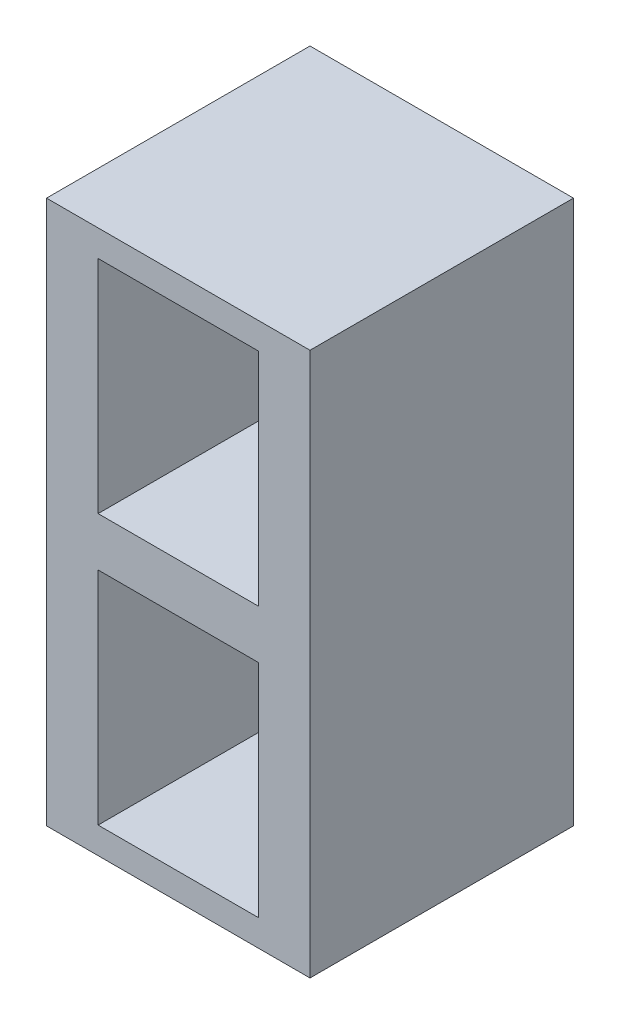
ISO-10303-21;
HEADER;
FILE_DESCRIPTION(('STEP AP214'),'2;1');
FILE_NAME('part.step','',(''),(''),'','','');
FILE_SCHEMA(('AUTOMOTIVE_DESIGN { 1 0 10303 214 1 1 1 1 }'));
ENDSEC;
DATA;
#1=APPLICATION_CONTEXT('core data for automotive mechanical design processes');
#2=APPLICATION_PROTOCOL_DEFINITION('international standard','automotive_design',2000,#1);
#3=PRODUCT_CONTEXT('',#1,'mechanical');
#4=PRODUCT('Part','Part','',(#3));
#5=PRODUCT_RELATED_PRODUCT_CATEGORY('part','',(#4));
#6=PRODUCT_DEFINITION_FORMATION('','',#4);
#7=PRODUCT_DEFINITION_CONTEXT('part definition',#1,'design');
#8=PRODUCT_DEFINITION('design','',#6,#7);
#9=PRODUCT_DEFINITION_SHAPE('','',#8);
#10=(LENGTH_UNIT() NAMED_UNIT(*) SI_UNIT(.MILLI.,.METRE.));
#11=(NAMED_UNIT(*) PLANE_ANGLE_UNIT() SI_UNIT($,.RADIAN.));
#12=(NAMED_UNIT(*) SI_UNIT($,.STERADIAN.) SOLID_ANGLE_UNIT());
#13=UNCERTAINTY_MEASURE_WITH_UNIT(LENGTH_MEASURE(1.E-05),#10,'distance_accuracy_value','');
#14=(GEOMETRIC_REPRESENTATION_CONTEXT(3) GLOBAL_UNCERTAINTY_ASSIGNED_CONTEXT((#13)) GLOBAL_UNIT_ASSIGNED_CONTEXT((#10,
#11,#12)) REPRESENTATION_CONTEXT('',''));
#15=CARTESIAN_POINT('',(0.,0.,0.));
#16=DIRECTION('',(0.,0.,1.));
#17=DIRECTION('',(1.,0.,0.));
#18=AXIS2_PLACEMENT_3D('',#15,#16,#17);
#19=CARTESIAN_POINT('',(94.5,390.,-94.5));
#20=DIRECTION('',(-1.,0.,0.));
#21=DIRECTION('',(0.,0.,1.));
#22=AXIS2_PLACEMENT_3D('',#19,#20,#21);
#23=PLANE('',#22);
#24=DIRECTION('',(0.,0.,-1.));
#25=VECTOR('',#24,1.);
#26=CARTESIAN_POINT('',(94.5,0.,-94.5));
#27=LINE('',#26,#25);
#28=CARTESIAN_POINT('',(94.5,0.,94.5));
#29=VERTEX_POINT('',#28);
#30=CARTESIAN_POINT('',(94.5,0.,-94.5));
#31=VERTEX_POINT('',#30);
#32=EDGE_CURVE('E183',#29,#31,#27,.T.);
#33=ORIENTED_EDGE('',*,*,#32,.T.);
#34=DIRECTION('',(0.,-1.,0.));
#35=VECTOR('',#34,1.);
#36=CARTESIAN_POINT('',(94.5,390.,-94.5));
#37=LINE('',#36,#35);
#38=CARTESIAN_POINT('',(94.5,390.,-94.5));
#39=VERTEX_POINT('',#38);
#40=EDGE_CURVE('E11',#39,#31,#37,.T.);
#41=ORIENTED_EDGE('',*,*,#40,.F.);
#42=DIRECTION('',(0.,0.,-1.));
#43=VECTOR('',#42,1.);
#44=CARTESIAN_POINT('',(94.5,390.,-94.5));
#45=LINE('',#44,#43);
#46=CARTESIAN_POINT('',(94.5,390.,94.5));
#47=VERTEX_POINT('',#46);
#48=EDGE_CURVE('E190',#47,#39,#45,.T.);
#49=ORIENTED_EDGE('',*,*,#48,.F.);
#50=DIRECTION('',(0.,-1.,0.));
#51=VECTOR('',#50,1.);
#52=CARTESIAN_POINT('',(94.5,390.,94.5));
#53=LINE('',#52,#51);
#54=EDGE_CURVE('E200',#47,#29,#53,.T.);
#55=ORIENTED_EDGE('',*,*,#54,.T.);
#56=EDGE_LOOP('',(#33,#41,#49,#55));
#57=FACE_BOUND('',#56,.T.);
#58=ADVANCED_FACE('F33',(#57),#23,.F.);
#59=CARTESIAN_POINT('',(94.5,390.,-94.5));
#60=DIRECTION('',(0.,0.,1.));
#61=DIRECTION('',(1.,0.,0.));
#62=AXIS2_PLACEMENT_3D('',#59,#60,#61);
#63=PLANE('',#62);
#64=DIRECTION('',(0.,-1.,0.));
#65=VECTOR('',#64,1.);
#66=CARTESIAN_POINT('',(-57.5,19.,-94.5));
#67=LINE('',#66,#65);
#68=CARTESIAN_POINT('',(-57.5,177.5,-94.5));
#69=VERTEX_POINT('',#68);
#70=CARTESIAN_POINT('',(-57.5,19.,-94.5));
#71=VERTEX_POINT('',#70);
#72=EDGE_CURVE('E129',#69,#71,#67,.T.);
#73=ORIENTED_EDGE('',*,*,#72,.T.);
#74=DIRECTION('',(1.,0.,0.));
#75=VECTOR('',#74,1.);
#76=CARTESIAN_POINT('',(-57.5,19.,-94.5));
#77=LINE('',#76,#75);
#78=CARTESIAN_POINT('',(57.5,19.,-94.5));
#79=VERTEX_POINT('',#78);
#80=EDGE_CURVE('E123',#71,#79,#77,.T.);
#81=ORIENTED_EDGE('',*,*,#80,.T.);
#82=DIRECTION('',(0.,1.,0.));
#83=VECTOR('',#82,1.);
#84=CARTESIAN_POINT('',(57.5,19.,-94.5));
#85=LINE('',#84,#83);
#86=CARTESIAN_POINT('',(57.5,177.5,-94.5));
#87=VERTEX_POINT('',#86);
#88=EDGE_CURVE('E132',#79,#87,#85,.T.);
#89=ORIENTED_EDGE('',*,*,#88,.T.);
#90=DIRECTION('',(-1.,0.,0.));
#91=VECTOR('',#90,1.);
#92=CARTESIAN_POINT('',(-57.5,177.5,-94.5));
#93=LINE('',#92,#91);
#94=EDGE_CURVE('E47',#87,#69,#93,.T.);
#95=ORIENTED_EDGE('',*,*,#94,.T.);
#96=EDGE_LOOP('',(#73,#81,#89,#95));
#97=FACE_BOUND('',#96,.T.);
#98=DIRECTION('',(-1.,0.,0.));
#99=VECTOR('',#98,1.);
#100=CARTESIAN_POINT('',(-57.5,371.,-94.5));
#101=LINE('',#100,#99);
#102=CARTESIAN_POINT('',(57.5,371.,-94.5));
#103=VERTEX_POINT('',#102);
#104=CARTESIAN_POINT('',(-57.5,371.,-94.5));
#105=VERTEX_POINT('',#104);
#106=EDGE_CURVE('E168',#103,#105,#101,.T.);
#107=ORIENTED_EDGE('',*,*,#106,.T.);
#108=DIRECTION('',(0.,-1.,0.));
#109=VECTOR('',#108,1.);
#110=CARTESIAN_POINT('',(-57.5,371.,-94.5));
#111=LINE('',#110,#109);
#112=CARTESIAN_POINT('',(-57.5,212.5,-94.5));
#113=VERTEX_POINT('',#112);
#114=EDGE_CURVE('E158',#105,#113,#111,.T.);
#115=ORIENTED_EDGE('',*,*,#114,.T.);
#116=DIRECTION('',(1.,0.,0.));
#117=VECTOR('',#116,1.);
#118=CARTESIAN_POINT('',(-57.5,212.5,-94.5));
#119=LINE('',#118,#117);
#120=CARTESIAN_POINT('',(57.5,212.5,-94.5));
#121=VERTEX_POINT('',#120);
#122=EDGE_CURVE('E161',#113,#121,#119,.T.);
#123=ORIENTED_EDGE('',*,*,#122,.T.);
#124=DIRECTION('',(0.,1.,0.));
#125=VECTOR('',#124,1.);
#126=CARTESIAN_POINT('',(57.5,371.,-94.5));
#127=LINE('',#126,#125);
#128=EDGE_CURVE('E165',#121,#103,#127,.T.);
#129=ORIENTED_EDGE('',*,*,#128,.T.);
#130=EDGE_LOOP('',(#107,#115,#123,#129));
#131=FACE_BOUND('',#130,.T.);
#132=DIRECTION('',(-1.,0.,0.));
#133=VECTOR('',#132,1.);
#134=CARTESIAN_POINT('',(94.5,0.,-94.5));
#135=LINE('',#134,#133);
#136=CARTESIAN_POINT('',(-94.5,0.,-94.5));
#137=VERTEX_POINT('',#136);
#138=EDGE_CURVE('E203',#31,#137,#135,.T.);
#139=ORIENTED_EDGE('',*,*,#138,.T.);
#140=DIRECTION('',(0.,-1.,0.));
#141=VECTOR('',#140,1.);
#142=CARTESIAN_POINT('',(-94.5,390.,-94.5));
#143=LINE('',#142,#141);
#144=CARTESIAN_POINT('',(-94.5,390.,-94.5));
#145=VERTEX_POINT('',#144);
#146=EDGE_CURVE('E40',#145,#137,#143,.T.);
#147=ORIENTED_EDGE('',*,*,#146,.F.);
#148=DIRECTION('',(-1.,0.,0.));
#149=VECTOR('',#148,1.);
#150=CARTESIAN_POINT('',(94.5,390.,-94.5));
#151=LINE('',#150,#149);
#152=EDGE_CURVE('E193',#39,#145,#151,.T.);
#153=ORIENTED_EDGE('',*,*,#152,.F.);
#154=ORIENTED_EDGE('',*,*,#40,.T.);
#155=EDGE_LOOP('',(#139,#147,#153,#154));
#156=FACE_BOUND('',#155,.T.);
#157=ADVANCED_FACE('F136',(#97,#131,#156),#63,.F.);
#158=CARTESIAN_POINT('',(-94.5,390.,-94.5));
#159=DIRECTION('',(1.,0.,0.));
#160=DIRECTION('',(0.,0.,-1.));
#161=AXIS2_PLACEMENT_3D('',#158,#159,#160);
#162=PLANE('',#161);
#163=DIRECTION('',(0.,0.,1.));
#164=VECTOR('',#163,1.);
#165=CARTESIAN_POINT('',(-94.5,0.,-94.5));
#166=LINE('',#165,#164);
#167=CARTESIAN_POINT('',(-94.5,0.,94.5));
#168=VERTEX_POINT('',#167);
#169=EDGE_CURVE('E205',#137,#168,#166,.T.);
#170=ORIENTED_EDGE('',*,*,#169,.T.);
#171=DIRECTION('',(0.,-1.,0.));
#172=VECTOR('',#171,1.);
#173=CARTESIAN_POINT('',(-94.5,390.,94.5));
#174=LINE('',#173,#172);
#175=CARTESIAN_POINT('',(-94.5,390.,94.5));
#176=VERTEX_POINT('',#175);
#177=EDGE_CURVE('E210',#176,#168,#174,.T.);
#178=ORIENTED_EDGE('',*,*,#177,.F.);
#179=DIRECTION('',(0.,0.,1.));
#180=VECTOR('',#179,1.);
#181=CARTESIAN_POINT('',(-94.5,390.,-94.5));
#182=LINE('',#181,#180);
#183=EDGE_CURVE('E196',#145,#176,#182,.T.);
#184=ORIENTED_EDGE('',*,*,#183,.F.);
#185=ORIENTED_EDGE('',*,*,#146,.T.);
#186=EDGE_LOOP('',(#170,#178,#184,#185));
#187=FACE_BOUND('',#186,.T.);
#188=ADVANCED_FACE('F217',(#187),#162,.F.);
#189=CARTESIAN_POINT('',(94.5,390.,94.5));
#190=DIRECTION('',(0.,0.,-1.));
#191=DIRECTION('',(-1.,0.,0.));
#192=AXIS2_PLACEMENT_3D('',#189,#190,#191);
#193=PLANE('',#192);
#194=DIRECTION('',(0.,1.,0.));
#195=VECTOR('',#194,1.);
#196=CARTESIAN_POINT('',(57.5,19.,94.5));
#197=LINE('',#196,#195);
#198=CARTESIAN_POINT('',(57.5,19.,94.5));
#199=VERTEX_POINT('',#198);
#200=CARTESIAN_POINT('',(57.5,177.5,94.5));
#201=VERTEX_POINT('',#200);
#202=EDGE_CURVE('E148',#199,#201,#197,.T.);
#203=ORIENTED_EDGE('',*,*,#202,.F.);
#204=DIRECTION('',(1.,0.,0.));
#205=VECTOR('',#204,1.);
#206=CARTESIAN_POINT('',(-57.5,19.,94.5));
#207=LINE('',#206,#205);
#208=CARTESIAN_POINT('',(-57.5,19.,94.5));
#209=VERTEX_POINT('',#208);
#210=EDGE_CURVE('E55',#209,#199,#207,.T.);
#211=ORIENTED_EDGE('',*,*,#210,.F.);
#212=DIRECTION('',(0.,-1.,0.));
#213=VECTOR('',#212,1.);
#214=CARTESIAN_POINT('',(-57.5,19.,94.5));
#215=LINE('',#214,#213);
#216=CARTESIAN_POINT('',(-57.5,177.5,94.5));
#217=VERTEX_POINT('',#216);
#218=EDGE_CURVE('E139',#217,#209,#215,.T.);
#219=ORIENTED_EDGE('',*,*,#218,.F.);
#220=DIRECTION('',(-1.,0.,0.));
#221=VECTOR('',#220,1.);
#222=CARTESIAN_POINT('',(-57.5,177.5,94.5));
#223=LINE('',#222,#221);
#224=EDGE_CURVE('E142',#201,#217,#223,.T.);
#225=ORIENTED_EDGE('',*,*,#224,.F.);
#226=EDGE_LOOP('',(#203,#211,#219,#225));
#227=FACE_BOUND('',#226,.T.);
#228=DIRECTION('',(1.,0.,0.));
#229=VECTOR('',#228,1.);
#230=CARTESIAN_POINT('',(-57.5,212.5,94.5));
#231=LINE('',#230,#229);
#232=CARTESIAN_POINT('',(-57.5,212.5,94.5));
#233=VERTEX_POINT('',#232);
#234=CARTESIAN_POINT('',(57.5,212.5,94.5));
#235=VERTEX_POINT('',#234);
#236=EDGE_CURVE('E173',#233,#235,#231,.T.);
#237=ORIENTED_EDGE('',*,*,#236,.F.);
#238=DIRECTION('',(0.,-1.,0.));
#239=VECTOR('',#238,1.);
#240=CARTESIAN_POINT('',(-57.5,371.,94.5));
#241=LINE('',#240,#239);
#242=CARTESIAN_POINT('',(-57.5,371.,94.5));
#243=VERTEX_POINT('',#242);
#244=EDGE_CURVE('E154',#243,#233,#241,.T.);
#245=ORIENTED_EDGE('',*,*,#244,.F.);
#246=DIRECTION('',(-1.,0.,0.));
#247=VECTOR('',#246,1.);
#248=CARTESIAN_POINT('',(-57.5,371.,94.5));
#249=LINE('',#248,#247);
#250=CARTESIAN_POINT('',(57.5,371.,94.5));
#251=VERTEX_POINT('',#250);
#252=EDGE_CURVE('E162',#251,#243,#249,.T.);
#253=ORIENTED_EDGE('',*,*,#252,.F.);
#254=DIRECTION('',(0.,1.,0.));
#255=VECTOR('',#254,1.);
#256=CARTESIAN_POINT('',(57.5,371.,94.5));
#257=LINE('',#256,#255);
#258=EDGE_CURVE('E176',#235,#251,#257,.T.);
#259=ORIENTED_EDGE('',*,*,#258,.F.);
#260=EDGE_LOOP('',(#237,#245,#253,#259));
#261=FACE_BOUND('',#260,.T.);
#262=DIRECTION('',(1.,0.,0.));
#263=VECTOR('',#262,1.);
#264=CARTESIAN_POINT('',(94.5,0.,94.5));
#265=LINE('',#264,#263);
#266=EDGE_CURVE('E194',#168,#29,#265,.T.);
#267=ORIENTED_EDGE('',*,*,#266,.T.);
#268=ORIENTED_EDGE('',*,*,#54,.F.);
#269=DIRECTION('',(1.,0.,0.));
#270=VECTOR('',#269,1.);
#271=CARTESIAN_POINT('',(94.5,390.,94.5));
#272=LINE('',#271,#270);
#273=EDGE_CURVE('E198',#176,#47,#272,.T.);
#274=ORIENTED_EDGE('',*,*,#273,.F.);
#275=ORIENTED_EDGE('',*,*,#177,.T.);
#276=EDGE_LOOP('',(#267,#268,#274,#275));
#277=FACE_BOUND('',#276,.T.);
#278=ADVANCED_FACE('F226',(#227,#261,#277),#193,.F.);
#279=CARTESIAN_POINT('',(0.,390.,0.));
#280=DIRECTION('',(0.,-1.,0.));
#281=DIRECTION('',(0.,0.,-1.));
#282=AXIS2_PLACEMENT_3D('',#279,#280,#281);
#283=PLANE('',#282);
#284=ORIENTED_EDGE('',*,*,#48,.T.);
#285=ORIENTED_EDGE('',*,*,#152,.T.);
#286=ORIENTED_EDGE('',*,*,#183,.T.);
#287=ORIENTED_EDGE('',*,*,#273,.T.);
#288=EDGE_LOOP('',(#284,#285,#286,#287));
#289=FACE_BOUND('',#288,.T.);
#290=ADVANCED_FACE('F232',(#289),#283,.F.);
#291=CARTESIAN_POINT('',(0.,0.,0.));
#292=DIRECTION('',(0.,-1.,0.));
#293=DIRECTION('',(0.,0.,-1.));
#294=AXIS2_PLACEMENT_3D('',#291,#292,#293);
#295=PLANE('',#294);
#296=ORIENTED_EDGE('',*,*,#32,.F.);
#297=ORIENTED_EDGE('',*,*,#266,.F.);
#298=ORIENTED_EDGE('',*,*,#169,.F.);
#299=ORIENTED_EDGE('',*,*,#138,.F.);
#300=EDGE_LOOP('',(#296,#297,#298,#299));
#301=FACE_BOUND('',#300,.T.);
#302=ADVANCED_FACE('F223',(#301),#295,.T.);
#303=CARTESIAN_POINT('',(-57.5,371.,-94.5));
#304=DIRECTION('',(-1.,0.,0.));
#305=DIRECTION('',(0.,-1.,0.));
#306=AXIS2_PLACEMENT_3D('',#303,#304,#305);
#307=PLANE('',#306);
#308=ORIENTED_EDGE('',*,*,#244,.T.);
#309=DIRECTION('',(0.,0.,1.));
#310=VECTOR('',#309,1.);
#311=CARTESIAN_POINT('',(-57.5,212.5,-94.5));
#312=LINE('',#311,#310);
#313=EDGE_CURVE('E171',#113,#233,#312,.T.);
#314=ORIENTED_EDGE('',*,*,#313,.F.);
#315=ORIENTED_EDGE('',*,*,#114,.F.);
#316=DIRECTION('',(0.,0.,1.));
#317=VECTOR('',#316,1.);
#318=CARTESIAN_POINT('',(-57.5,371.,-94.5));
#319=LINE('',#318,#317);
#320=EDGE_CURVE('E181',#105,#243,#319,.T.);
#321=ORIENTED_EDGE('',*,*,#320,.T.);
#322=EDGE_LOOP('',(#308,#314,#315,#321));
#323=FACE_BOUND('',#322,.T.);
#324=ADVANCED_FACE('F245',(#323),#307,.F.);
#325=CARTESIAN_POINT('',(-57.5,371.,-94.5));
#326=DIRECTION('',(0.,1.,0.));
#327=DIRECTION('',(0.,0.,1.));
#328=AXIS2_PLACEMENT_3D('',#325,#326,#327);
#329=PLANE('',#328);
#330=ORIENTED_EDGE('',*,*,#252,.T.);
#331=ORIENTED_EDGE('',*,*,#320,.F.);
#332=ORIENTED_EDGE('',*,*,#106,.F.);
#333=DIRECTION('',(0.,0.,1.));
#334=VECTOR('',#333,1.);
#335=CARTESIAN_POINT('',(57.5,371.,-94.5));
#336=LINE('',#335,#334);
#337=EDGE_CURVE('E184',#103,#251,#336,.T.);
#338=ORIENTED_EDGE('',*,*,#337,.T.);
#339=EDGE_LOOP('',(#330,#331,#332,#338));
#340=FACE_BOUND('',#339,.T.);
#341=ADVANCED_FACE('F250',(#340),#329,.F.);
#342=CARTESIAN_POINT('',(57.5,371.,-94.5));
#343=DIRECTION('',(1.,0.,0.));
#344=DIRECTION('',(0.,1.,0.));
#345=AXIS2_PLACEMENT_3D('',#342,#343,#344);
#346=PLANE('',#345);
#347=ORIENTED_EDGE('',*,*,#258,.T.);
#348=ORIENTED_EDGE('',*,*,#337,.F.);
#349=ORIENTED_EDGE('',*,*,#128,.F.);
#350=DIRECTION('',(0.,0.,1.));
#351=VECTOR('',#350,1.);
#352=CARTESIAN_POINT('',(57.5,212.5,-94.5));
#353=LINE('',#352,#351);
#354=EDGE_CURVE('E186',#121,#235,#353,.T.);
#355=ORIENTED_EDGE('',*,*,#354,.T.);
#356=EDGE_LOOP('',(#347,#348,#349,#355));
#357=FACE_BOUND('',#356,.T.);
#358=ADVANCED_FACE('F255',(#357),#346,.F.);
#359=CARTESIAN_POINT('',(-57.5,212.5,-94.5));
#360=DIRECTION('',(0.,-1.,0.));
#361=DIRECTION('',(0.,0.,-1.));
#362=AXIS2_PLACEMENT_3D('',#359,#360,#361);
#363=PLANE('',#362);
#364=ORIENTED_EDGE('',*,*,#236,.T.);
#365=ORIENTED_EDGE('',*,*,#354,.F.);
#366=ORIENTED_EDGE('',*,*,#122,.F.);
#367=ORIENTED_EDGE('',*,*,#313,.T.);
#368=EDGE_LOOP('',(#364,#365,#366,#367));
#369=FACE_BOUND('',#368,.T.);
#370=ADVANCED_FACE('F252',(#369),#363,.F.);
#371=CARTESIAN_POINT('',(-57.5,19.,-94.5));
#372=DIRECTION('',(0.,-1.,0.));
#373=DIRECTION('',(0.,0.,-1.));
#374=AXIS2_PLACEMENT_3D('',#371,#372,#373);
#375=PLANE('',#374);
#376=ORIENTED_EDGE('',*,*,#210,.T.);
#377=DIRECTION('',(0.,0.,1.));
#378=VECTOR('',#377,1.);
#379=CARTESIAN_POINT('',(57.5,19.,-94.5));
#380=LINE('',#379,#378);
#381=EDGE_CURVE('E119',#79,#199,#380,.T.);
#382=ORIENTED_EDGE('',*,*,#381,.F.);
#383=ORIENTED_EDGE('',*,*,#80,.F.);
#384=DIRECTION('',(0.,0.,1.));
#385=VECTOR('',#384,1.);
#386=CARTESIAN_POINT('',(-57.5,19.,-94.5));
#387=LINE('',#386,#385);
#388=EDGE_CURVE('E152',#71,#209,#387,.T.);
#389=ORIENTED_EDGE('',*,*,#388,.T.);
#390=EDGE_LOOP('',(#376,#382,#383,#389));
#391=FACE_BOUND('',#390,.T.);
#392=ADVANCED_FACE('F121',(#391),#375,.F.);
#393=CARTESIAN_POINT('',(-57.5,19.,-94.5));
#394=DIRECTION('',(-1.,0.,0.));
#395=DIRECTION('',(0.,-1.,0.));
#396=AXIS2_PLACEMENT_3D('',#393,#394,#395);
#397=PLANE('',#396);
#398=ORIENTED_EDGE('',*,*,#218,.T.);
#399=ORIENTED_EDGE('',*,*,#388,.F.);
#400=ORIENTED_EDGE('',*,*,#72,.F.);
#401=DIRECTION('',(0.,0.,1.));
#402=VECTOR('',#401,1.);
#403=CARTESIAN_POINT('',(-57.5,177.5,-94.5));
#404=LINE('',#403,#402);
#405=EDGE_CURVE('E155',#69,#217,#404,.T.);
#406=ORIENTED_EDGE('',*,*,#405,.T.);
#407=EDGE_LOOP('',(#398,#399,#400,#406));
#408=FACE_BOUND('',#407,.T.);
#409=ADVANCED_FACE('F265',(#408),#397,.F.);
#410=CARTESIAN_POINT('',(-57.5,177.5,-94.5));
#411=DIRECTION('',(0.,1.,0.));
#412=DIRECTION('',(0.,0.,1.));
#413=AXIS2_PLACEMENT_3D('',#410,#411,#412);
#414=PLANE('',#413);
#415=ORIENTED_EDGE('',*,*,#224,.T.);
#416=ORIENTED_EDGE('',*,*,#405,.F.);
#417=ORIENTED_EDGE('',*,*,#94,.F.);
#418=DIRECTION('',(0.,0.,1.));
#419=VECTOR('',#418,1.);
#420=CARTESIAN_POINT('',(57.5,177.5,-94.5));
#421=LINE('',#420,#419);
#422=EDGE_CURVE('E128',#87,#201,#421,.T.);
#423=ORIENTED_EDGE('',*,*,#422,.T.);
#424=EDGE_LOOP('',(#415,#416,#417,#423));
#425=FACE_BOUND('',#424,.T.);
#426=ADVANCED_FACE('F268',(#425),#414,.F.);
#427=CARTESIAN_POINT('',(57.5,19.,-94.5));
#428=DIRECTION('',(1.,0.,0.));
#429=DIRECTION('',(0.,1.,0.));
#430=AXIS2_PLACEMENT_3D('',#427,#428,#429);
#431=PLANE('',#430);
#432=ORIENTED_EDGE('',*,*,#202,.T.);
#433=ORIENTED_EDGE('',*,*,#422,.F.);
#434=ORIENTED_EDGE('',*,*,#88,.F.);
#435=ORIENTED_EDGE('',*,*,#381,.T.);
#436=EDGE_LOOP('',(#432,#433,#434,#435));
#437=FACE_BOUND('',#436,.T.);
#438=ADVANCED_FACE('F133',(#437),#431,.F.);
#439=CLOSED_SHELL('',(#58,#157,#188,#278,#290,#302,#324,#341,#358,#370,#392,#409,#426,#438));
#440=MANIFOLD_SOLID_BREP('B2',#439);
#441=ADVANCED_BREP_SHAPE_REPRESENTATION('',(#18,#440),#14);
#442=SHAPE_DEFINITION_REPRESENTATION(#9,#441);
ENDSEC;
END-ISO-10303-21;
